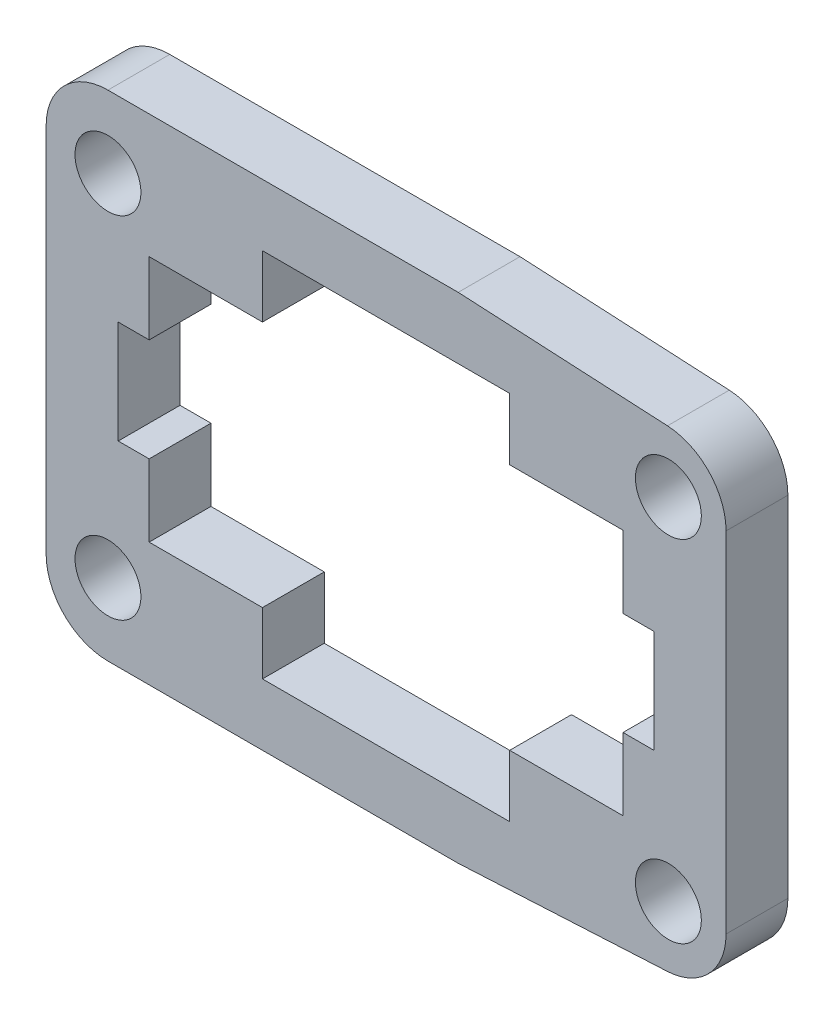
ISO-10303-21;
HEADER;
FILE_DESCRIPTION(('STEP AP214'),'2;1');
FILE_NAME('part.step','',(''),(''),'','','');
FILE_SCHEMA(('AUTOMOTIVE_DESIGN { 1 0 10303 214 1 1 1 1 }'));
ENDSEC;
DATA;
#1=APPLICATION_CONTEXT('core data for automotive mechanical design processes');
#2=APPLICATION_PROTOCOL_DEFINITION('international standard','automotive_design',2000,#1);
#3=PRODUCT_CONTEXT('',#1,'mechanical');
#4=PRODUCT('Part','Part','',(#3));
#5=PRODUCT_RELATED_PRODUCT_CATEGORY('part','',(#4));
#6=PRODUCT_DEFINITION_FORMATION('','',#4);
#7=PRODUCT_DEFINITION_CONTEXT('part definition',#1,'design');
#8=PRODUCT_DEFINITION('design','',#6,#7);
#9=PRODUCT_DEFINITION_SHAPE('','',#8);
#10=(LENGTH_UNIT() NAMED_UNIT(*) SI_UNIT(.MILLI.,.METRE.));
#11=(NAMED_UNIT(*) PLANE_ANGLE_UNIT() SI_UNIT($,.RADIAN.));
#12=(NAMED_UNIT(*) SI_UNIT($,.STERADIAN.) SOLID_ANGLE_UNIT());
#13=UNCERTAINTY_MEASURE_WITH_UNIT(LENGTH_MEASURE(1.E-05),#10,'distance_accuracy_value','');
#14=(GEOMETRIC_REPRESENTATION_CONTEXT(3) GLOBAL_UNCERTAINTY_ASSIGNED_CONTEXT((#13)) GLOBAL_UNIT_ASSIGNED_CONTEXT((#10,
#11,#12)) REPRESENTATION_CONTEXT('',''));
#15=CARTESIAN_POINT('',(0.,0.,0.));
#16=DIRECTION('',(0.,0.,1.));
#17=DIRECTION('',(1.,0.,0.));
#18=AXIS2_PLACEMENT_3D('',#15,#16,#17);
#19=CARTESIAN_POINT('',(24.0010920540107,23.4678047027526,0.));
#20=DIRECTION('',(0.0523034033778794,0.998631240245913,0.));
#21=DIRECTION('',(-0.998631240245913,0.0523034033778794,0.));
#22=AXIS2_PLACEMENT_3D('',#19,#20,#21);
#23=PLANE('',#22);
#24=DIRECTION('',(-0.998631240245913,0.0523034033778794,0.));
#25=VECTOR('',#24,1.);
#26=CARTESIAN_POINT('',(24.0010920540107,23.4678047027526,3.));
#27=LINE('',#26,#25);
#28=CARTESIAN_POINT('',(24.0010920540107,23.4678047027526,3.));
#29=VERTEX_POINT('',#28);
#30=CARTESIAN_POINT('',(13.8436818438771,23.9998,3.));
#31=VERTEX_POINT('',#30);
#32=EDGE_CURVE('E412',#29,#31,#27,.T.);
#33=ORIENTED_EDGE('',*,*,#32,.F.);
#34=DIRECTION('',(0.,0.,1.));
#35=VECTOR('',#34,1.);
#36=CARTESIAN_POINT('',(24.0010920540107,23.4678047027526,0.));
#37=LINE('',#36,#35);
#38=CARTESIAN_POINT('',(24.0010920540107,23.4678047027526,0.));
#39=VERTEX_POINT('',#38);
#40=EDGE_CURVE('E11',#39,#29,#37,.T.);
#41=ORIENTED_EDGE('',*,*,#40,.F.);
#42=DIRECTION('',(-0.998631240245913,0.0523034033778794,0.));
#43=VECTOR('',#42,1.);
#44=CARTESIAN_POINT('',(24.0010920540107,23.4678047027526,0.));
#45=LINE('',#44,#43);
#46=CARTESIAN_POINT('',(13.8436818438771,23.9998,0.));
#47=VERTEX_POINT('',#46);
#48=EDGE_CURVE('E466',#39,#47,#45,.T.);
#49=ORIENTED_EDGE('',*,*,#48,.T.);
#50=DIRECTION('',(0.,0.,1.));
#51=VECTOR('',#50,1.);
#52=CARTESIAN_POINT('',(13.8436818438771,23.9998,0.));
#53=LINE('',#52,#51);
#54=EDGE_CURVE('E42',#47,#31,#53,.T.);
#55=ORIENTED_EDGE('',*,*,#54,.T.);
#56=EDGE_LOOP('',(#33,#41,#49,#55));
#57=FACE_BOUND('',#56,.T.);
#58=ADVANCED_FACE('F39',(#57),#23,.T.);
#59=CARTESIAN_POINT('',(23.844181843877,20.4719109820149,0.));
#60=DIRECTION('',(0.,0.,1.));
#61=DIRECTION('',(1.,0.,0.));
#62=AXIS2_PLACEMENT_3D('',#59,#60,#61);
#63=CYLINDRICAL_SURFACE('',#62,2.99999999999996);
#64=CARTESIAN_POINT('',(23.844181843877,20.4719109820149,3.));
#65=DIRECTION('',(0.,0.,1.));
#66=DIRECTION('',(1.,0.,0.));
#67=AXIS2_PLACEMENT_3D('',#64,#65,#66);
#68=CIRCLE('',#67,2.99999999999996);
#69=CARTESIAN_POINT('',(26.844181843877,20.4719109820149,3.));
#70=VERTEX_POINT('',#69);
#71=EDGE_CURVE('E471',#70,#29,#68,.T.);
#72=ORIENTED_EDGE('',*,*,#71,.F.);
#73=DIRECTION('',(0.,0.,1.));
#74=VECTOR('',#73,1.);
#75=CARTESIAN_POINT('',(26.844181843877,20.4719109820149,0.));
#76=LINE('',#75,#74);
#77=CARTESIAN_POINT('',(26.844181843877,20.4719109820149,0.));
#78=VERTEX_POINT('',#77);
#79=EDGE_CURVE('E48',#78,#70,#76,.T.);
#80=ORIENTED_EDGE('',*,*,#79,.F.);
#81=CARTESIAN_POINT('',(23.844181843877,20.4719109820149,0.));
#82=DIRECTION('',(0.,0.,1.));
#83=DIRECTION('',(1.,0.,0.));
#84=AXIS2_PLACEMENT_3D('',#81,#82,#83);
#85=CIRCLE('',#84,2.99999999999996);
#86=EDGE_CURVE('E503',#78,#39,#85,.T.);
#87=ORIENTED_EDGE('',*,*,#86,.T.);
#88=ORIENTED_EDGE('',*,*,#40,.T.);
#89=EDGE_LOOP('',(#72,#80,#87,#88));
#90=FACE_BOUND('',#89,.T.);
#91=ADVANCED_FACE('F580',(#90),#63,.T.);
#92=CARTESIAN_POINT('',(26.844181843877,3.52888902362418,0.));
#93=DIRECTION('',(1.,0.,0.));
#94=DIRECTION('',(0.,1.,0.));
#95=AXIS2_PLACEMENT_3D('',#92,#93,#94);
#96=PLANE('',#95);
#97=DIRECTION('',(0.,1.,0.));
#98=VECTOR('',#97,1.);
#99=CARTESIAN_POINT('',(26.844181843877,3.52888902362418,3.));
#100=LINE('',#99,#98);
#101=CARTESIAN_POINT('',(26.844181843877,3.52888902362418,3.));
#102=VERTEX_POINT('',#101);
#103=EDGE_CURVE('E538',#102,#70,#100,.T.);
#104=ORIENTED_EDGE('',*,*,#103,.F.);
#105=DIRECTION('',(0.,0.,1.));
#106=VECTOR('',#105,1.);
#107=CARTESIAN_POINT('',(26.844181843877,3.52888902362418,0.));
#108=LINE('',#107,#106);
#109=CARTESIAN_POINT('',(26.844181843877,3.52888902362418,0.));
#110=VERTEX_POINT('',#109);
#111=EDGE_CURVE('E547',#110,#102,#108,.T.);
#112=ORIENTED_EDGE('',*,*,#111,.F.);
#113=DIRECTION('',(0.,1.,0.));
#114=VECTOR('',#113,1.);
#115=CARTESIAN_POINT('',(26.844181843877,3.52888902362418,0.));
#116=LINE('',#115,#114);
#117=EDGE_CURVE('E499',#110,#78,#116,.T.);
#118=ORIENTED_EDGE('',*,*,#117,.T.);
#119=ORIENTED_EDGE('',*,*,#79,.T.);
#120=EDGE_LOOP('',(#104,#112,#118,#119));
#121=FACE_BOUND('',#120,.T.);
#122=ADVANCED_FACE('F607',(#121),#96,.T.);
#123=CARTESIAN_POINT('',(23.844181843877,3.52888902362418,0.));
#124=DIRECTION('',(0.,0.,1.));
#125=DIRECTION('',(1.,0.,0.));
#126=AXIS2_PLACEMENT_3D('',#123,#124,#125);
#127=CYLINDRICAL_SURFACE('',#126,3.);
#128=CARTESIAN_POINT('',(23.844181843877,3.52888902362418,3.));
#129=DIRECTION('',(0.,0.,1.));
#130=DIRECTION('',(1.,0.,0.));
#131=AXIS2_PLACEMENT_3D('',#128,#129,#130);
#132=CIRCLE('',#131,3.);
#133=CARTESIAN_POINT('',(24.0013861888821,0.533010722706151,3.));
#134=VERTEX_POINT('',#133);
#135=EDGE_CURVE('E534',#134,#102,#132,.T.);
#136=ORIENTED_EDGE('',*,*,#135,.F.);
#137=DIRECTION('',(0.,0.,1.));
#138=VECTOR('',#137,1.);
#139=CARTESIAN_POINT('',(24.0013861888821,0.533010722706151,0.));
#140=LINE('',#139,#138);
#141=CARTESIAN_POINT('',(24.0013861888821,0.533010722706151,0.));
#142=VERTEX_POINT('',#141);
#143=EDGE_CURVE('E550',#142,#134,#140,.T.);
#144=ORIENTED_EDGE('',*,*,#143,.F.);
#145=CARTESIAN_POINT('',(23.844181843877,3.52888902362418,0.));
#146=DIRECTION('',(0.,0.,1.));
#147=DIRECTION('',(1.,0.,0.));
#148=AXIS2_PLACEMENT_3D('',#145,#146,#147);
#149=CIRCLE('',#148,3.);
#150=EDGE_CURVE('E495',#142,#110,#149,.T.);
#151=ORIENTED_EDGE('',*,*,#150,.T.);
#152=ORIENTED_EDGE('',*,*,#111,.T.);
#153=EDGE_LOOP('',(#136,#144,#151,#152));
#154=FACE_BOUND('',#153,.T.);
#155=ADVANCED_FACE('F605',(#154),#127,.T.);
#156=CARTESIAN_POINT('',(13.8436818438771,0.,0.));
#157=DIRECTION('',(0.0524014483350339,-0.998626100306011,0.));
#158=DIRECTION('',(0.998626100306011,0.0524014483350339,0.));
#159=AXIS2_PLACEMENT_3D('',#156,#157,#158);
#160=PLANE('',#159);
#161=DIRECTION('',(0.998626100306011,0.0524014483350339,0.));
#162=VECTOR('',#161,1.);
#163=CARTESIAN_POINT('',(13.8436818438771,0.,3.));
#164=LINE('',#163,#162);
#165=CARTESIAN_POINT('',(13.8436818438771,0.,3.));
#166=VERTEX_POINT('',#165);
#167=EDGE_CURVE('E530',#166,#134,#164,.T.);
#168=ORIENTED_EDGE('',*,*,#167,.F.);
#169=DIRECTION('',(0.,0.,1.));
#170=VECTOR('',#169,1.);
#171=CARTESIAN_POINT('',(13.8436818438771,0.,0.));
#172=LINE('',#171,#170);
#173=CARTESIAN_POINT('',(13.8436818438771,0.,0.));
#174=VERTEX_POINT('',#173);
#175=EDGE_CURVE('E553',#174,#166,#172,.T.);
#176=ORIENTED_EDGE('',*,*,#175,.F.);
#177=DIRECTION('',(0.998626100306011,0.0524014483350339,0.));
#178=VECTOR('',#177,1.);
#179=CARTESIAN_POINT('',(13.8436818438771,0.,0.));
#180=LINE('',#179,#178);
#181=EDGE_CURVE('E491',#174,#142,#180,.T.);
#182=ORIENTED_EDGE('',*,*,#181,.T.);
#183=ORIENTED_EDGE('',*,*,#143,.T.);
#184=EDGE_LOOP('',(#168,#176,#182,#183));
#185=FACE_BOUND('',#184,.T.);
#186=ADVANCED_FACE('F601',(#185),#160,.T.);
#187=CARTESIAN_POINT('',(-3.15711815612296,0.,0.));
#188=DIRECTION('',(0.,-1.,0.));
#189=DIRECTION('',(0.,0.,-1.));
#190=AXIS2_PLACEMENT_3D('',#187,#188,#189);
#191=PLANE('',#190);
#192=DIRECTION('',(1.,0.,0.));
#193=VECTOR('',#192,1.);
#194=CARTESIAN_POINT('',(-3.15711815612296,0.,3.));
#195=LINE('',#194,#193);
#196=CARTESIAN_POINT('',(-3.15711815612296,0.,3.));
#197=VERTEX_POINT('',#196);
#198=EDGE_CURVE('E526',#197,#166,#195,.T.);
#199=ORIENTED_EDGE('',*,*,#198,.F.);
#200=DIRECTION('',(0.,0.,1.));
#201=VECTOR('',#200,1.);
#202=CARTESIAN_POINT('',(-3.15711815612296,0.,0.));
#203=LINE('',#202,#201);
#204=CARTESIAN_POINT('',(-3.15711815612296,0.,0.));
#205=VERTEX_POINT('',#204);
#206=EDGE_CURVE('E556',#205,#197,#203,.T.);
#207=ORIENTED_EDGE('',*,*,#206,.F.);
#208=DIRECTION('',(1.,0.,0.));
#209=VECTOR('',#208,1.);
#210=CARTESIAN_POINT('',(-3.15711815612296,0.,0.));
#211=LINE('',#210,#209);
#212=EDGE_CURVE('E487',#205,#174,#211,.T.);
#213=ORIENTED_EDGE('',*,*,#212,.T.);
#214=ORIENTED_EDGE('',*,*,#175,.T.);
#215=EDGE_LOOP('',(#199,#207,#213,#214));
#216=FACE_BOUND('',#215,.T.);
#217=ADVANCED_FACE('F597',(#216),#191,.T.);
#218=CARTESIAN_POINT('',(-3.15711815612296,3.,0.));
#219=DIRECTION('',(0.,0.,1.));
#220=DIRECTION('',(1.,0.,0.));
#221=AXIS2_PLACEMENT_3D('',#218,#219,#220);
#222=CYLINDRICAL_SURFACE('',#221,3.);
#223=CARTESIAN_POINT('',(-3.15711815612296,3.,3.));
#224=DIRECTION('',(0.,0.,1.));
#225=DIRECTION('',(1.,0.,0.));
#226=AXIS2_PLACEMENT_3D('',#223,#224,#225);
#227=CIRCLE('',#226,3.);
#228=CARTESIAN_POINT('',(-6.15711815612296,3.,3.));
#229=VERTEX_POINT('',#228);
#230=EDGE_CURVE('E522',#229,#197,#227,.T.);
#231=ORIENTED_EDGE('',*,*,#230,.F.);
#232=DIRECTION('',(0.,0.,1.));
#233=VECTOR('',#232,1.);
#234=CARTESIAN_POINT('',(-6.15711815612296,3.,0.));
#235=LINE('',#234,#233);
#236=CARTESIAN_POINT('',(-6.15711815612296,3.,0.));
#237=VERTEX_POINT('',#236);
#238=EDGE_CURVE('E559',#237,#229,#235,.T.);
#239=ORIENTED_EDGE('',*,*,#238,.F.);
#240=CARTESIAN_POINT('',(-3.15711815612296,3.,0.));
#241=DIRECTION('',(0.,0.,1.));
#242=DIRECTION('',(1.,0.,0.));
#243=AXIS2_PLACEMENT_3D('',#240,#241,#242);
#244=CIRCLE('',#243,3.);
#245=EDGE_CURVE('E483',#237,#205,#244,.T.);
#246=ORIENTED_EDGE('',*,*,#245,.T.);
#247=ORIENTED_EDGE('',*,*,#206,.T.);
#248=EDGE_LOOP('',(#231,#239,#246,#247));
#249=FACE_BOUND('',#248,.T.);
#250=ADVANCED_FACE('F593',(#249),#222,.T.);
#251=CARTESIAN_POINT('',(-6.15711815612297,20.9998,0.));
#252=DIRECTION('',(-1.,0.,0.));
#253=DIRECTION('',(0.,-1.,0.));
#254=AXIS2_PLACEMENT_3D('',#251,#252,#253);
#255=PLANE('',#254);
#256=DIRECTION('',(0.,-1.,0.));
#257=VECTOR('',#256,1.);
#258=CARTESIAN_POINT('',(-6.15711815612297,20.9998,3.));
#259=LINE('',#258,#257);
#260=CARTESIAN_POINT('',(-6.15711815612296,20.9998,3.));
#261=VERTEX_POINT('',#260);
#262=EDGE_CURVE('E518',#261,#229,#259,.T.);
#263=ORIENTED_EDGE('',*,*,#262,.F.);
#264=DIRECTION('',(0.,0.,1.));
#265=VECTOR('',#264,1.);
#266=CARTESIAN_POINT('',(-6.15711815612296,20.9998,0.));
#267=LINE('',#266,#265);
#268=CARTESIAN_POINT('',(-6.15711815612296,20.9998,0.));
#269=VERTEX_POINT('',#268);
#270=EDGE_CURVE('E562',#269,#261,#267,.T.);
#271=ORIENTED_EDGE('',*,*,#270,.F.);
#272=DIRECTION('',(0.,-1.,0.));
#273=VECTOR('',#272,1.);
#274=CARTESIAN_POINT('',(-6.15711815612297,20.9998,0.));
#275=LINE('',#274,#273);
#276=EDGE_CURVE('E479',#269,#237,#275,.T.);
#277=ORIENTED_EDGE('',*,*,#276,.T.);
#278=ORIENTED_EDGE('',*,*,#238,.T.);
#279=EDGE_LOOP('',(#263,#271,#277,#278));
#280=FACE_BOUND('',#279,.T.);
#281=ADVANCED_FACE('F591',(#280),#255,.T.);
#282=CARTESIAN_POINT('',(-3.15711815612296,20.9998,0.));
#283=DIRECTION('',(0.,0.,1.));
#284=DIRECTION('',(1.,0.,0.));
#285=AXIS2_PLACEMENT_3D('',#282,#283,#284);
#286=CYLINDRICAL_SURFACE('',#285,3.);
#287=CARTESIAN_POINT('',(-3.15711815612296,20.9998,3.));
#288=DIRECTION('',(0.,0.,1.));
#289=DIRECTION('',(1.,0.,0.));
#290=AXIS2_PLACEMENT_3D('',#287,#288,#289);
#291=CIRCLE('',#290,3.);
#292=CARTESIAN_POINT('',(-3.15711815612296,23.9998,3.));
#293=VERTEX_POINT('',#292);
#294=EDGE_CURVE('E514',#293,#261,#291,.T.);
#295=ORIENTED_EDGE('',*,*,#294,.F.);
#296=DIRECTION('',(0.,0.,1.));
#297=VECTOR('',#296,1.);
#298=CARTESIAN_POINT('',(-3.15711815612296,23.9998,0.));
#299=LINE('',#298,#297);
#300=CARTESIAN_POINT('',(-3.15711815612296,23.9998,0.));
#301=VERTEX_POINT('',#300);
#302=EDGE_CURVE('E564',#301,#293,#299,.T.);
#303=ORIENTED_EDGE('',*,*,#302,.F.);
#304=CARTESIAN_POINT('',(-3.15711815612296,20.9998,0.));
#305=DIRECTION('',(0.,0.,1.));
#306=DIRECTION('',(1.,0.,0.));
#307=AXIS2_PLACEMENT_3D('',#304,#305,#306);
#308=CIRCLE('',#307,3.);
#309=EDGE_CURVE('E475',#301,#269,#308,.T.);
#310=ORIENTED_EDGE('',*,*,#309,.T.);
#311=ORIENTED_EDGE('',*,*,#270,.T.);
#312=EDGE_LOOP('',(#295,#303,#310,#311));
#313=FACE_BOUND('',#312,.T.);
#314=ADVANCED_FACE('F587',(#313),#286,.T.);
#315=CARTESIAN_POINT('',(13.8436818438771,23.9998,0.));
#316=DIRECTION('',(0.,1.,0.));
#317=DIRECTION('',(0.,0.,1.));
#318=AXIS2_PLACEMENT_3D('',#315,#316,#317);
#319=PLANE('',#318);
#320=DIRECTION('',(-1.,0.,0.));
#321=VECTOR('',#320,1.);
#322=CARTESIAN_POINT('',(13.8436818438771,23.9998,3.));
#323=LINE('',#322,#321);
#324=EDGE_CURVE('E510',#31,#293,#323,.T.);
#325=ORIENTED_EDGE('',*,*,#324,.F.);
#326=ORIENTED_EDGE('',*,*,#54,.F.);
#327=DIRECTION('',(-1.,0.,0.));
#328=VECTOR('',#327,1.);
#329=CARTESIAN_POINT('',(13.8436818438771,23.9998,0.));
#330=LINE('',#329,#328);
#331=EDGE_CURVE('E470',#47,#301,#330,.T.);
#332=ORIENTED_EDGE('',*,*,#331,.T.);
#333=ORIENTED_EDGE('',*,*,#302,.T.);
#334=EDGE_LOOP('',(#325,#326,#332,#333));
#335=FACE_BOUND('',#334,.T.);
#336=ADVANCED_FACE('F574',(#335),#319,.T.);
#337=CARTESIAN_POINT('',(-3.15711815612296,20.9998,0.));
#338=DIRECTION('',(0.,0.,1.));
#339=DIRECTION('',(1.,0.,0.));
#340=AXIS2_PLACEMENT_3D('',#337,#338,#339);
#341=PLANE('',#340);
#342=CARTESIAN_POINT('',(-3.15601815612294,3.50114834928544,0.));
#343=DIRECTION('',(0.,0.,1.));
#344=DIRECTION('',(1.,0.,0.));
#345=AXIS2_PLACEMENT_3D('',#342,#343,#344);
#346=CIRCLE('',#345,1.6);
#347=CARTESIAN_POINT('',(-1.55601815612294,3.50114834928544,0.));
#348=VERTEX_POINT('',#347);
#349=EDGE_CURVE('E940',#348,#348,#346,.T.);
#350=ORIENTED_EDGE('',*,*,#349,.T.);
#351=EDGE_LOOP('',(#350));
#352=FACE_BOUND('',#351,.T.);
#353=CARTESIAN_POINT('',(24.044031843877,3.50114834928544,0.));
#354=DIRECTION('',(0.,0.,1.));
#355=DIRECTION('',(1.,0.,0.));
#356=AXIS2_PLACEMENT_3D('',#353,#354,#355);
#357=CIRCLE('',#356,1.6);
#358=CARTESIAN_POINT('',(25.644031843877,3.50114834928544,0.));
#359=VERTEX_POINT('',#358);
#360=EDGE_CURVE('E967',#359,#359,#357,.T.);
#361=ORIENTED_EDGE('',*,*,#360,.T.);
#362=EDGE_LOOP('',(#361));
#363=FACE_BOUND('',#362,.T.);
#364=CARTESIAN_POINT('',(24.044031843877,20.4983516507146,0.));
#365=DIRECTION('',(0.,0.,1.));
#366=DIRECTION('',(1.,0.,0.));
#367=AXIS2_PLACEMENT_3D('',#364,#365,#366);
#368=CIRCLE('',#367,1.6);
#369=CARTESIAN_POINT('',(25.644031843877,20.4983516507146,0.));
#370=VERTEX_POINT('',#369);
#371=EDGE_CURVE('E956',#370,#370,#368,.T.);
#372=ORIENTED_EDGE('',*,*,#371,.T.);
#373=EDGE_LOOP('',(#372));
#374=FACE_BOUND('',#373,.T.);
#375=CARTESIAN_POINT('',(-3.15601815612294,20.4983516507146,0.));
#376=DIRECTION('',(0.,0.,1.));
#377=DIRECTION('',(1.,0.,0.));
#378=AXIS2_PLACEMENT_3D('',#375,#376,#377);
#379=CIRCLE('',#378,1.6);
#380=CARTESIAN_POINT('',(-1.55601815612294,20.4983516507146,0.));
#381=VERTEX_POINT('',#380);
#382=EDGE_CURVE('E339',#381,#381,#379,.T.);
#383=ORIENTED_EDGE('',*,*,#382,.T.);
#384=EDGE_LOOP('',(#383));
#385=FACE_BOUND('',#384,.T.);
#386=DIRECTION('',(-1.,0.,0.));
#387=VECTOR('',#386,1.);
#388=CARTESIAN_POINT('',(21.843181843877,14.4995,0.));
#389=LINE('',#388,#387);
#390=CARTESIAN_POINT('',(23.343481843877,14.4995,0.));
#391=VERTEX_POINT('',#390);
#392=CARTESIAN_POINT('',(21.843181843877,14.4995,0.));
#393=VERTEX_POINT('',#392);
#394=EDGE_CURVE('E246',#391,#393,#389,.T.);
#395=ORIENTED_EDGE('',*,*,#394,.T.);
#396=DIRECTION('',(0.,1.,0.));
#397=VECTOR('',#396,1.);
#398=CARTESIAN_POINT('',(21.843181843877,17.9998,0.));
#399=LINE('',#398,#397);
#400=CARTESIAN_POINT('',(21.843181843877,17.9998,0.));
#401=VERTEX_POINT('',#400);
#402=EDGE_CURVE('E239',#393,#401,#399,.T.);
#403=ORIENTED_EDGE('',*,*,#402,.T.);
#404=DIRECTION('',(-1.,0.,0.));
#405=VECTOR('',#404,1.);
#406=CARTESIAN_POINT('',(16.3433818438771,17.9998,0.));
#407=LINE('',#406,#405);
#408=CARTESIAN_POINT('',(16.3433818438771,17.9998,0.));
#409=VERTEX_POINT('',#408);
#410=EDGE_CURVE('E249',#401,#409,#407,.T.);
#411=ORIENTED_EDGE('',*,*,#410,.T.);
#412=DIRECTION('',(0.,1.,0.));
#413=VECTOR('',#412,1.);
#414=CARTESIAN_POINT('',(16.3433818438771,20.9998,0.));
#415=LINE('',#414,#413);
#416=CARTESIAN_POINT('',(16.3433818438771,20.9998,0.));
#417=VERTEX_POINT('',#416);
#418=EDGE_CURVE('E56',#409,#417,#415,.T.);
#419=ORIENTED_EDGE('',*,*,#418,.T.);
#420=DIRECTION('',(-1.,0.,0.));
#421=VECTOR('',#420,1.);
#422=CARTESIAN_POINT('',(4.34338184387702,20.9998,0.));
#423=LINE('',#422,#421);
#424=CARTESIAN_POINT('',(4.34338184387702,20.9998,0.));
#425=VERTEX_POINT('',#424);
#426=EDGE_CURVE('E271',#417,#425,#423,.T.);
#427=ORIENTED_EDGE('',*,*,#426,.T.);
#428=DIRECTION('',(0.,-1.,0.));
#429=VECTOR('',#428,1.);
#430=CARTESIAN_POINT('',(4.34338184387702,17.9998,0.));
#431=LINE('',#430,#429);
#432=CARTESIAN_POINT('',(4.34338184387702,17.9998,0.));
#433=VERTEX_POINT('',#432);
#434=EDGE_CURVE('E275',#425,#433,#431,.T.);
#435=ORIENTED_EDGE('',*,*,#434,.T.);
#436=DIRECTION('',(-1.,0.,0.));
#437=VECTOR('',#436,1.);
#438=CARTESIAN_POINT('',(-1.15651815612298,17.9998,0.));
#439=LINE('',#438,#437);
#440=CARTESIAN_POINT('',(-1.15651815612298,17.9998,0.));
#441=VERTEX_POINT('',#440);
#442=EDGE_CURVE('E279',#433,#441,#439,.T.);
#443=ORIENTED_EDGE('',*,*,#442,.T.);
#444=DIRECTION('',(0.,-1.,0.));
#445=VECTOR('',#444,1.);
#446=CARTESIAN_POINT('',(-1.15651815612297,14.4995,0.));
#447=LINE('',#446,#445);
#448=CARTESIAN_POINT('',(-1.15651815612297,14.4995,0.));
#449=VERTEX_POINT('',#448);
#450=EDGE_CURVE('E283',#441,#449,#447,.T.);
#451=ORIENTED_EDGE('',*,*,#450,.T.);
#452=DIRECTION('',(-1.,0.,0.));
#453=VECTOR('',#452,1.);
#454=CARTESIAN_POINT('',(-2.65681815612294,14.4995,0.));
#455=LINE('',#454,#453);
#456=CARTESIAN_POINT('',(-2.65681815612294,14.4995,0.));
#457=VERTEX_POINT('',#456);
#458=EDGE_CURVE('E287',#449,#457,#455,.T.);
#459=ORIENTED_EDGE('',*,*,#458,.T.);
#460=DIRECTION('',(0.,-1.,0.));
#461=VECTOR('',#460,1.);
#462=CARTESIAN_POINT('',(-2.65681815612294,9.5,0.));
#463=LINE('',#462,#461);
#464=CARTESIAN_POINT('',(-2.65681815612294,9.5,0.));
#465=VERTEX_POINT('',#464);
#466=EDGE_CURVE('E291',#457,#465,#463,.T.);
#467=ORIENTED_EDGE('',*,*,#466,.T.);
#468=DIRECTION('',(1.,0.,0.));
#469=VECTOR('',#468,1.);
#470=CARTESIAN_POINT('',(-1.15651815612297,9.5,0.));
#471=LINE('',#470,#469);
#472=CARTESIAN_POINT('',(-1.15651815612297,9.5,0.));
#473=VERTEX_POINT('',#472);
#474=EDGE_CURVE('E295',#465,#473,#471,.T.);
#475=ORIENTED_EDGE('',*,*,#474,.T.);
#476=DIRECTION('',(0.,-1.,0.));
#477=VECTOR('',#476,1.);
#478=CARTESIAN_POINT('',(-1.15651815612298,6.,0.));
#479=LINE('',#478,#477);
#480=CARTESIAN_POINT('',(-1.15651815612298,6.,0.));
#481=VERTEX_POINT('',#480);
#482=EDGE_CURVE('E299',#473,#481,#479,.T.);
#483=ORIENTED_EDGE('',*,*,#482,.T.);
#484=DIRECTION('',(1.,0.,0.));
#485=VECTOR('',#484,1.);
#486=CARTESIAN_POINT('',(4.34338184387701,6.,0.));
#487=LINE('',#486,#485);
#488=CARTESIAN_POINT('',(4.34338184387701,6.,0.));
#489=VERTEX_POINT('',#488);
#490=EDGE_CURVE('E303',#481,#489,#487,.T.);
#491=ORIENTED_EDGE('',*,*,#490,.T.);
#492=DIRECTION('',(0.,-1.,0.));
#493=VECTOR('',#492,1.);
#494=CARTESIAN_POINT('',(4.34338184387701,3.,0.));
#495=LINE('',#494,#493);
#496=CARTESIAN_POINT('',(4.34338184387701,3.,0.));
#497=VERTEX_POINT('',#496);
#498=EDGE_CURVE('E307',#489,#497,#495,.T.);
#499=ORIENTED_EDGE('',*,*,#498,.T.);
#500=DIRECTION('',(1.,0.,0.));
#501=VECTOR('',#500,1.);
#502=CARTESIAN_POINT('',(16.3433818438771,3.,0.));
#503=LINE('',#502,#501);
#504=CARTESIAN_POINT('',(16.3433818438771,3.,0.));
#505=VERTEX_POINT('',#504);
#506=EDGE_CURVE('E311',#497,#505,#503,.T.);
#507=ORIENTED_EDGE('',*,*,#506,.T.);
#508=DIRECTION('',(0.,1.,0.));
#509=VECTOR('',#508,1.);
#510=CARTESIAN_POINT('',(16.3433818438771,6.,0.));
#511=LINE('',#510,#509);
#512=CARTESIAN_POINT('',(16.3433818438771,6.,0.));
#513=VERTEX_POINT('',#512);
#514=EDGE_CURVE('E315',#505,#513,#511,.T.);
#515=ORIENTED_EDGE('',*,*,#514,.T.);
#516=DIRECTION('',(1.,0.,0.));
#517=VECTOR('',#516,1.);
#518=CARTESIAN_POINT('',(21.843181843877,6.,0.));
#519=LINE('',#518,#517);
#520=CARTESIAN_POINT('',(21.843181843877,6.,0.));
#521=VERTEX_POINT('',#520);
#522=EDGE_CURVE('E319',#513,#521,#519,.T.);
#523=ORIENTED_EDGE('',*,*,#522,.T.);
#524=DIRECTION('',(0.,1.,0.));
#525=VECTOR('',#524,1.);
#526=CARTESIAN_POINT('',(21.843181843877,9.5,0.));
#527=LINE('',#526,#525);
#528=CARTESIAN_POINT('',(21.843181843877,9.5,0.));
#529=VERTEX_POINT('',#528);
#530=EDGE_CURVE('E323',#521,#529,#527,.T.);
#531=ORIENTED_EDGE('',*,*,#530,.T.);
#532=DIRECTION('',(1.,0.,0.));
#533=VECTOR('',#532,1.);
#534=CARTESIAN_POINT('',(23.343481843877,9.5,0.));
#535=LINE('',#534,#533);
#536=CARTESIAN_POINT('',(23.343481843877,9.5,0.));
#537=VERTEX_POINT('',#536);
#538=EDGE_CURVE('E327',#529,#537,#535,.T.);
#539=ORIENTED_EDGE('',*,*,#538,.T.);
#540=DIRECTION('',(0.,1.,0.));
#541=VECTOR('',#540,1.);
#542=CARTESIAN_POINT('',(23.343481843877,14.4995,0.));
#543=LINE('',#542,#541);
#544=EDGE_CURVE('E331',#537,#391,#543,.T.);
#545=ORIENTED_EDGE('',*,*,#544,.T.);
#546=EDGE_LOOP('',(#395,#403,#411,#419,#427,#435,#443,#451,#459,#467,#475,#483,#491,#499,#507,
#515,#523,#531,#539,#545));
#547=FACE_BOUND('',#546,.T.);
#548=ORIENTED_EDGE('',*,*,#48,.F.);
#549=ORIENTED_EDGE('',*,*,#86,.F.);
#550=ORIENTED_EDGE('',*,*,#117,.F.);
#551=ORIENTED_EDGE('',*,*,#150,.F.);
#552=ORIENTED_EDGE('',*,*,#181,.F.);
#553=ORIENTED_EDGE('',*,*,#212,.F.);
#554=ORIENTED_EDGE('',*,*,#245,.F.);
#555=ORIENTED_EDGE('',*,*,#276,.F.);
#556=ORIENTED_EDGE('',*,*,#309,.F.);
#557=ORIENTED_EDGE('',*,*,#331,.F.);
#558=EDGE_LOOP('',(#548,#549,#550,#551,#552,#553,#554,#555,#556,#557));
#559=FACE_BOUND('',#558,.T.);
#560=ADVANCED_FACE('F254',(#352,#363,#374,#385,#547,#559),#341,.F.);
#561=CARTESIAN_POINT('',(-3.15711815612296,20.9998,3.));
#562=DIRECTION('',(0.,0.,1.));
#563=DIRECTION('',(1.,0.,0.));
#564=AXIS2_PLACEMENT_3D('',#561,#562,#563);
#565=PLANE('',#564);
#566=CARTESIAN_POINT('',(-3.15601815612294,3.50114834928544,3.));
#567=DIRECTION('',(0.,0.,1.));
#568=DIRECTION('',(1.,0.,0.));
#569=AXIS2_PLACEMENT_3D('',#566,#567,#568);
#570=CIRCLE('',#569,1.6);
#571=CARTESIAN_POINT('',(-1.55601815612294,3.50114834928544,3.));
#572=VERTEX_POINT('',#571);
#573=EDGE_CURVE('E943',#572,#572,#570,.T.);
#574=ORIENTED_EDGE('',*,*,#573,.F.);
#575=EDGE_LOOP('',(#574));
#576=FACE_BOUND('',#575,.T.);
#577=CARTESIAN_POINT('',(24.044031843877,3.50114834928544,3.));
#578=DIRECTION('',(0.,0.,1.));
#579=DIRECTION('',(1.,0.,0.));
#580=AXIS2_PLACEMENT_3D('',#577,#578,#579);
#581=CIRCLE('',#580,1.6);
#582=CARTESIAN_POINT('',(25.644031843877,3.50114834928544,3.));
#583=VERTEX_POINT('',#582);
#584=EDGE_CURVE('E947',#583,#583,#581,.T.);
#585=ORIENTED_EDGE('',*,*,#584,.F.);
#586=EDGE_LOOP('',(#585));
#587=FACE_BOUND('',#586,.T.);
#588=CARTESIAN_POINT('',(24.044031843877,20.4983516507146,3.));
#589=DIRECTION('',(0.,0.,1.));
#590=DIRECTION('',(1.,0.,0.));
#591=AXIS2_PLACEMENT_3D('',#588,#589,#590);
#592=CIRCLE('',#591,1.6);
#593=CARTESIAN_POINT('',(25.644031843877,20.4983516507146,3.));
#594=VERTEX_POINT('',#593);
#595=EDGE_CURVE('E961',#594,#594,#592,.T.);
#596=ORIENTED_EDGE('',*,*,#595,.F.);
#597=EDGE_LOOP('',(#596));
#598=FACE_BOUND('',#597,.T.);
#599=CARTESIAN_POINT('',(-3.15601815612294,20.4983516507146,3.));
#600=DIRECTION('',(0.,0.,1.));
#601=DIRECTION('',(1.,0.,0.));
#602=AXIS2_PLACEMENT_3D('',#599,#600,#601);
#603=CIRCLE('',#602,1.6);
#604=CARTESIAN_POINT('',(-1.55601815612294,20.4983516507146,3.));
#605=VERTEX_POINT('',#604);
#606=EDGE_CURVE('E266',#605,#605,#603,.T.);
#607=ORIENTED_EDGE('',*,*,#606,.F.);
#608=EDGE_LOOP('',(#607));
#609=FACE_BOUND('',#608,.T.);
#610=DIRECTION('',(0.,1.,0.));
#611=VECTOR('',#610,1.);
#612=CARTESIAN_POINT('',(21.843181843877,17.9998,3.));
#613=LINE('',#612,#611);
#614=CARTESIAN_POINT('',(21.843181843877,14.4995,3.));
#615=VERTEX_POINT('',#614);
#616=CARTESIAN_POINT('',(21.843181843877,17.9998,3.));
#617=VERTEX_POINT('',#616);
#618=EDGE_CURVE('E64',#615,#617,#613,.T.);
#619=ORIENTED_EDGE('',*,*,#618,.F.);
#620=DIRECTION('',(-1.,0.,0.));
#621=VECTOR('',#620,1.);
#622=CARTESIAN_POINT('',(21.843181843877,14.4995,3.));
#623=LINE('',#622,#621);
#624=CARTESIAN_POINT('',(23.343481843877,14.4995,3.));
#625=VERTEX_POINT('',#624);
#626=EDGE_CURVE('E259',#625,#615,#623,.T.);
#627=ORIENTED_EDGE('',*,*,#626,.F.);
#628=DIRECTION('',(0.,1.,0.));
#629=VECTOR('',#628,1.);
#630=CARTESIAN_POINT('',(23.343481843877,14.4995,3.));
#631=LINE('',#630,#629);
#632=CARTESIAN_POINT('',(23.343481843877,9.5,3.));
#633=VERTEX_POINT('',#632);
#634=EDGE_CURVE('E263',#633,#625,#631,.T.);
#635=ORIENTED_EDGE('',*,*,#634,.F.);
#636=DIRECTION('',(1.,0.,0.));
#637=VECTOR('',#636,1.);
#638=CARTESIAN_POINT('',(23.343481843877,9.5,3.));
#639=LINE('',#638,#637);
#640=CARTESIAN_POINT('',(21.843181843877,9.5,3.));
#641=VERTEX_POINT('',#640);
#642=EDGE_CURVE('E402',#641,#633,#639,.T.);
#643=ORIENTED_EDGE('',*,*,#642,.F.);
#644=DIRECTION('',(0.,1.,0.));
#645=VECTOR('',#644,1.);
#646=CARTESIAN_POINT('',(21.843181843877,9.5,3.));
#647=LINE('',#646,#645);
#648=CARTESIAN_POINT('',(21.843181843877,6.,3.));
#649=VERTEX_POINT('',#648);
#650=EDGE_CURVE('E398',#649,#641,#647,.T.);
#651=ORIENTED_EDGE('',*,*,#650,.F.);
#652=DIRECTION('',(1.,0.,0.));
#653=VECTOR('',#652,1.);
#654=CARTESIAN_POINT('',(21.843181843877,6.,3.));
#655=LINE('',#654,#653);
#656=CARTESIAN_POINT('',(16.3433818438771,6.,3.));
#657=VERTEX_POINT('',#656);
#658=EDGE_CURVE('E394',#657,#649,#655,.T.);
#659=ORIENTED_EDGE('',*,*,#658,.F.);
#660=DIRECTION('',(0.,1.,0.));
#661=VECTOR('',#660,1.);
#662=CARTESIAN_POINT('',(16.3433818438771,6.,3.));
#663=LINE('',#662,#661);
#664=CARTESIAN_POINT('',(16.3433818438771,3.,3.));
#665=VERTEX_POINT('',#664);
#666=EDGE_CURVE('E390',#665,#657,#663,.T.);
#667=ORIENTED_EDGE('',*,*,#666,.F.);
#668=DIRECTION('',(1.,0.,0.));
#669=VECTOR('',#668,1.);
#670=CARTESIAN_POINT('',(16.3433818438771,3.,3.));
#671=LINE('',#670,#669);
#672=CARTESIAN_POINT('',(4.34338184387701,3.,3.));
#673=VERTEX_POINT('',#672);
#674=EDGE_CURVE('E386',#673,#665,#671,.T.);
#675=ORIENTED_EDGE('',*,*,#674,.F.);
#676=DIRECTION('',(0.,-1.,0.));
#677=VECTOR('',#676,1.);
#678=CARTESIAN_POINT('',(4.34338184387701,3.,3.));
#679=LINE('',#678,#677);
#680=CARTESIAN_POINT('',(4.34338184387701,6.,3.));
#681=VERTEX_POINT('',#680);
#682=EDGE_CURVE('E382',#681,#673,#679,.T.);
#683=ORIENTED_EDGE('',*,*,#682,.F.);
#684=DIRECTION('',(1.,0.,0.));
#685=VECTOR('',#684,1.);
#686=CARTESIAN_POINT('',(4.34338184387701,6.,3.));
#687=LINE('',#686,#685);
#688=CARTESIAN_POINT('',(-1.15651815612298,6.,3.));
#689=VERTEX_POINT('',#688);
#690=EDGE_CURVE('E378',#689,#681,#687,.T.);
#691=ORIENTED_EDGE('',*,*,#690,.F.);
#692=DIRECTION('',(0.,-1.,0.));
#693=VECTOR('',#692,1.);
#694=CARTESIAN_POINT('',(-1.15651815612298,6.,3.));
#695=LINE('',#694,#693);
#696=CARTESIAN_POINT('',(-1.15651815612297,9.5,3.));
#697=VERTEX_POINT('',#696);
#698=EDGE_CURVE('E374',#697,#689,#695,.T.);
#699=ORIENTED_EDGE('',*,*,#698,.F.);
#700=DIRECTION('',(1.,0.,0.));
#701=VECTOR('',#700,1.);
#702=CARTESIAN_POINT('',(-1.15651815612297,9.5,3.));
#703=LINE('',#702,#701);
#704=CARTESIAN_POINT('',(-2.65681815612294,9.5,3.));
#705=VERTEX_POINT('',#704);
#706=EDGE_CURVE('E370',#705,#697,#703,.T.);
#707=ORIENTED_EDGE('',*,*,#706,.F.);
#708=DIRECTION('',(0.,-1.,0.));
#709=VECTOR('',#708,1.);
#710=CARTESIAN_POINT('',(-2.65681815612294,9.5,3.));
#711=LINE('',#710,#709);
#712=CARTESIAN_POINT('',(-2.65681815612294,14.4995,3.));
#713=VERTEX_POINT('',#712);
#714=EDGE_CURVE('E366',#713,#705,#711,.T.);
#715=ORIENTED_EDGE('',*,*,#714,.F.);
#716=DIRECTION('',(-1.,0.,0.));
#717=VECTOR('',#716,1.);
#718=CARTESIAN_POINT('',(-2.65681815612294,14.4995,3.));
#719=LINE('',#718,#717);
#720=CARTESIAN_POINT('',(-1.15651815612297,14.4995,3.));
#721=VERTEX_POINT('',#720);
#722=EDGE_CURVE('E362',#721,#713,#719,.T.);
#723=ORIENTED_EDGE('',*,*,#722,.F.);
#724=DIRECTION('',(0.,-1.,0.));
#725=VECTOR('',#724,1.);
#726=CARTESIAN_POINT('',(-1.15651815612297,14.4995,3.));
#727=LINE('',#726,#725);
#728=CARTESIAN_POINT('',(-1.15651815612298,17.9998,3.));
#729=VERTEX_POINT('',#728);
#730=EDGE_CURVE('E358',#729,#721,#727,.T.);
#731=ORIENTED_EDGE('',*,*,#730,.F.);
#732=DIRECTION('',(-1.,0.,0.));
#733=VECTOR('',#732,1.);
#734=CARTESIAN_POINT('',(-1.15651815612298,17.9998,3.));
#735=LINE('',#734,#733);
#736=CARTESIAN_POINT('',(4.34338184387702,17.9998,3.));
#737=VERTEX_POINT('',#736);
#738=EDGE_CURVE('E354',#737,#729,#735,.T.);
#739=ORIENTED_EDGE('',*,*,#738,.F.);
#740=DIRECTION('',(0.,-1.,0.));
#741=VECTOR('',#740,1.);
#742=CARTESIAN_POINT('',(4.34338184387702,17.9998,3.));
#743=LINE('',#742,#741);
#744=CARTESIAN_POINT('',(4.34338184387702,20.9998,3.));
#745=VERTEX_POINT('',#744);
#746=EDGE_CURVE('E350',#745,#737,#743,.T.);
#747=ORIENTED_EDGE('',*,*,#746,.F.);
#748=DIRECTION('',(-1.,0.,0.));
#749=VECTOR('',#748,1.);
#750=CARTESIAN_POINT('',(4.34338184387702,20.9998,3.));
#751=LINE('',#750,#749);
#752=CARTESIAN_POINT('',(16.3433818438771,20.9998,3.));
#753=VERTEX_POINT('',#752);
#754=EDGE_CURVE('E346',#753,#745,#751,.T.);
#755=ORIENTED_EDGE('',*,*,#754,.F.);
#756=DIRECTION('',(0.,1.,0.));
#757=VECTOR('',#756,1.);
#758=CARTESIAN_POINT('',(16.3433818438771,20.9998,3.));
#759=LINE('',#758,#757);
#760=CARTESIAN_POINT('',(16.3433818438771,17.9998,3.));
#761=VERTEX_POINT('',#760);
#762=EDGE_CURVE('E342',#761,#753,#759,.T.);
#763=ORIENTED_EDGE('',*,*,#762,.F.);
#764=DIRECTION('',(-1.,0.,0.));
#765=VECTOR('',#764,1.);
#766=CARTESIAN_POINT('',(16.3433818438771,17.9998,3.));
#767=LINE('',#766,#765);
#768=EDGE_CURVE('E338',#617,#761,#767,.T.);
#769=ORIENTED_EDGE('',*,*,#768,.F.);
#770=EDGE_LOOP('',(#619,#627,#635,#643,#651,#659,#667,#675,#683,#691,#699,#707,#715,#723,#731,
#739,#747,#755,#763,#769));
#771=FACE_BOUND('',#770,.T.);
#772=ORIENTED_EDGE('',*,*,#32,.T.);
#773=ORIENTED_EDGE('',*,*,#324,.T.);
#774=ORIENTED_EDGE('',*,*,#294,.T.);
#775=ORIENTED_EDGE('',*,*,#262,.T.);
#776=ORIENTED_EDGE('',*,*,#230,.T.);
#777=ORIENTED_EDGE('',*,*,#198,.T.);
#778=ORIENTED_EDGE('',*,*,#167,.T.);
#779=ORIENTED_EDGE('',*,*,#135,.T.);
#780=ORIENTED_EDGE('',*,*,#103,.T.);
#781=ORIENTED_EDGE('',*,*,#71,.T.);
#782=EDGE_LOOP('',(#772,#773,#774,#775,#776,#777,#778,#779,#780,#781));
#783=FACE_BOUND('',#782,.T.);
#784=ADVANCED_FACE('F576',(#576,#587,#598,#609,#771,#783),#565,.T.);
#785=CARTESIAN_POINT('',(21.843181843877,17.9998,0.));
#786=DIRECTION('',(1.,0.,0.));
#787=DIRECTION('',(0.,0.,-1.));
#788=AXIS2_PLACEMENT_3D('',#785,#786,#787);
#789=PLANE('',#788);
#790=ORIENTED_EDGE('',*,*,#618,.T.);
#791=DIRECTION('',(0.,0.,1.));
#792=VECTOR('',#791,1.);
#793=CARTESIAN_POINT('',(21.843181843877,17.9998,0.));
#794=LINE('',#793,#792);
#795=EDGE_CURVE('E235',#401,#617,#794,.T.);
#796=ORIENTED_EDGE('',*,*,#795,.F.);
#797=ORIENTED_EDGE('',*,*,#402,.F.);
#798=DIRECTION('',(0.,0.,1.));
#799=VECTOR('',#798,1.);
#800=CARTESIAN_POINT('',(21.843181843877,14.4995,0.));
#801=LINE('',#800,#799);
#802=EDGE_CURVE('E409',#393,#615,#801,.T.);
#803=ORIENTED_EDGE('',*,*,#802,.T.);
#804=EDGE_LOOP('',(#790,#796,#797,#803));
#805=FACE_BOUND('',#804,.T.);
#806=ADVANCED_FACE('F237',(#805),#789,.F.);
#807=CARTESIAN_POINT('',(21.843181843877,14.4995,0.));
#808=DIRECTION('',(0.,1.,0.));
#809=DIRECTION('',(0.,0.,1.));
#810=AXIS2_PLACEMENT_3D('',#807,#808,#809);
#811=PLANE('',#810);
#812=ORIENTED_EDGE('',*,*,#626,.T.);
#813=ORIENTED_EDGE('',*,*,#802,.F.);
#814=ORIENTED_EDGE('',*,*,#394,.F.);
#815=DIRECTION('',(0.,0.,1.));
#816=VECTOR('',#815,1.);
#817=CARTESIAN_POINT('',(23.343481843877,14.4995,0.));
#818=LINE('',#817,#816);
#819=EDGE_CURVE('E413',#391,#625,#818,.T.);
#820=ORIENTED_EDGE('',*,*,#819,.T.);
#821=EDGE_LOOP('',(#812,#813,#814,#820));
#822=FACE_BOUND('',#821,.T.);
#823=ADVANCED_FACE('F691',(#822),#811,.F.);
#824=CARTESIAN_POINT('',(23.343481843877,14.4995,0.));
#825=DIRECTION('',(1.,0.,0.));
#826=DIRECTION('',(0.,0.,-1.));
#827=AXIS2_PLACEMENT_3D('',#824,#825,#826);
#828=PLANE('',#827);
#829=ORIENTED_EDGE('',*,*,#634,.T.);
#830=ORIENTED_EDGE('',*,*,#819,.F.);
#831=ORIENTED_EDGE('',*,*,#544,.F.);
#832=DIRECTION('',(0.,0.,1.));
#833=VECTOR('',#832,1.);
#834=CARTESIAN_POINT('',(23.343481843877,9.5,0.));
#835=LINE('',#834,#833);
#836=EDGE_CURVE('E416',#537,#633,#835,.T.);
#837=ORIENTED_EDGE('',*,*,#836,.T.);
#838=EDGE_LOOP('',(#829,#830,#831,#837));
#839=FACE_BOUND('',#838,.T.);
#840=ADVANCED_FACE('F702',(#839),#828,.F.);
#841=CARTESIAN_POINT('',(23.343481843877,9.5,0.));
#842=DIRECTION('',(0.,-1.,0.));
#843=DIRECTION('',(0.,0.,-1.));
#844=AXIS2_PLACEMENT_3D('',#841,#842,#843);
#845=PLANE('',#844);
#846=ORIENTED_EDGE('',*,*,#642,.T.);
#847=ORIENTED_EDGE('',*,*,#836,.F.);
#848=ORIENTED_EDGE('',*,*,#538,.F.);
#849=DIRECTION('',(0.,0.,1.));
#850=VECTOR('',#849,1.);
#851=CARTESIAN_POINT('',(21.843181843877,9.5,0.));
#852=LINE('',#851,#850);
#853=EDGE_CURVE('E419',#529,#641,#852,.T.);
#854=ORIENTED_EDGE('',*,*,#853,.T.);
#855=EDGE_LOOP('',(#846,#847,#848,#854));
#856=FACE_BOUND('',#855,.T.);
#857=ADVANCED_FACE('F712',(#856),#845,.F.);
#858=CARTESIAN_POINT('',(21.843181843877,9.5,0.));
#859=DIRECTION('',(1.,0.,0.));
#860=DIRECTION('',(0.,0.,-1.));
#861=AXIS2_PLACEMENT_3D('',#858,#859,#860);
#862=PLANE('',#861);
#863=ORIENTED_EDGE('',*,*,#650,.T.);
#864=ORIENTED_EDGE('',*,*,#853,.F.);
#865=ORIENTED_EDGE('',*,*,#530,.F.);
#866=DIRECTION('',(0.,0.,1.));
#867=VECTOR('',#866,1.);
#868=CARTESIAN_POINT('',(21.843181843877,6.,0.));
#869=LINE('',#868,#867);
#870=EDGE_CURVE('E422',#521,#649,#869,.T.);
#871=ORIENTED_EDGE('',*,*,#870,.T.);
#872=EDGE_LOOP('',(#863,#864,#865,#871));
#873=FACE_BOUND('',#872,.T.);
#874=ADVANCED_FACE('F722',(#873),#862,.F.);
#875=CARTESIAN_POINT('',(21.843181843877,6.,0.));
#876=DIRECTION('',(0.,-1.,0.));
#877=DIRECTION('',(0.,0.,-1.));
#878=AXIS2_PLACEMENT_3D('',#875,#876,#877);
#879=PLANE('',#878);
#880=ORIENTED_EDGE('',*,*,#658,.T.);
#881=ORIENTED_EDGE('',*,*,#870,.F.);
#882=ORIENTED_EDGE('',*,*,#522,.F.);
#883=DIRECTION('',(0.,0.,1.));
#884=VECTOR('',#883,1.);
#885=CARTESIAN_POINT('',(16.3433818438771,6.,0.));
#886=LINE('',#885,#884);
#887=EDGE_CURVE('E425',#513,#657,#886,.T.);
#888=ORIENTED_EDGE('',*,*,#887,.T.);
#889=EDGE_LOOP('',(#880,#881,#882,#888));
#890=FACE_BOUND('',#889,.T.);
#891=ADVANCED_FACE('F732',(#890),#879,.F.);
#892=CARTESIAN_POINT('',(16.3433818438771,6.,0.));
#893=DIRECTION('',(1.,0.,0.));
#894=DIRECTION('',(0.,0.,-1.));
#895=AXIS2_PLACEMENT_3D('',#892,#893,#894);
#896=PLANE('',#895);
#897=ORIENTED_EDGE('',*,*,#666,.T.);
#898=ORIENTED_EDGE('',*,*,#887,.F.);
#899=ORIENTED_EDGE('',*,*,#514,.F.);
#900=DIRECTION('',(0.,0.,1.));
#901=VECTOR('',#900,1.);
#902=CARTESIAN_POINT('',(16.3433818438771,3.,0.));
#903=LINE('',#902,#901);
#904=EDGE_CURVE('E428',#505,#665,#903,.T.);
#905=ORIENTED_EDGE('',*,*,#904,.T.);
#906=EDGE_LOOP('',(#897,#898,#899,#905));
#907=FACE_BOUND('',#906,.T.);
#908=ADVANCED_FACE('F742',(#907),#896,.F.);
#909=CARTESIAN_POINT('',(16.3433818438771,3.,0.));
#910=DIRECTION('',(0.,-1.,0.));
#911=DIRECTION('',(0.,0.,-1.));
#912=AXIS2_PLACEMENT_3D('',#909,#910,#911);
#913=PLANE('',#912);
#914=ORIENTED_EDGE('',*,*,#674,.T.);
#915=ORIENTED_EDGE('',*,*,#904,.F.);
#916=ORIENTED_EDGE('',*,*,#506,.F.);
#917=DIRECTION('',(0.,0.,1.));
#918=VECTOR('',#917,1.);
#919=CARTESIAN_POINT('',(4.34338184387701,3.,0.));
#920=LINE('',#919,#918);
#921=EDGE_CURVE('E431',#497,#673,#920,.T.);
#922=ORIENTED_EDGE('',*,*,#921,.T.);
#923=EDGE_LOOP('',(#914,#915,#916,#922));
#924=FACE_BOUND('',#923,.T.);
#925=ADVANCED_FACE('F752',(#924),#913,.F.);
#926=CARTESIAN_POINT('',(4.34338184387701,3.,0.));
#927=DIRECTION('',(-1.,0.,0.));
#928=DIRECTION('',(0.,0.,1.));
#929=AXIS2_PLACEMENT_3D('',#926,#927,#928);
#930=PLANE('',#929);
#931=ORIENTED_EDGE('',*,*,#682,.T.);
#932=ORIENTED_EDGE('',*,*,#921,.F.);
#933=ORIENTED_EDGE('',*,*,#498,.F.);
#934=DIRECTION('',(0.,0.,1.));
#935=VECTOR('',#934,1.);
#936=CARTESIAN_POINT('',(4.34338184387701,6.,0.));
#937=LINE('',#936,#935);
#938=EDGE_CURVE('E434',#489,#681,#937,.T.);
#939=ORIENTED_EDGE('',*,*,#938,.T.);
#940=EDGE_LOOP('',(#931,#932,#933,#939));
#941=FACE_BOUND('',#940,.T.);
#942=ADVANCED_FACE('F762',(#941),#930,.F.);
#943=CARTESIAN_POINT('',(4.34338184387701,6.,0.));
#944=DIRECTION('',(0.,-1.,0.));
#945=DIRECTION('',(0.,0.,-1.));
#946=AXIS2_PLACEMENT_3D('',#943,#944,#945);
#947=PLANE('',#946);
#948=ORIENTED_EDGE('',*,*,#690,.T.);
#949=ORIENTED_EDGE('',*,*,#938,.F.);
#950=ORIENTED_EDGE('',*,*,#490,.F.);
#951=DIRECTION('',(0.,0.,1.));
#952=VECTOR('',#951,1.);
#953=CARTESIAN_POINT('',(-1.15651815612298,6.,0.));
#954=LINE('',#953,#952);
#955=EDGE_CURVE('E437',#481,#689,#954,.T.);
#956=ORIENTED_EDGE('',*,*,#955,.T.);
#957=EDGE_LOOP('',(#948,#949,#950,#956));
#958=FACE_BOUND('',#957,.T.);
#959=ADVANCED_FACE('F772',(#958),#947,.F.);
#960=CARTESIAN_POINT('',(-1.15651815612298,6.,0.));
#961=DIRECTION('',(-1.,0.,0.));
#962=DIRECTION('',(0.,-1.,0.));
#963=AXIS2_PLACEMENT_3D('',#960,#961,#962);
#964=PLANE('',#963);
#965=ORIENTED_EDGE('',*,*,#698,.T.);
#966=ORIENTED_EDGE('',*,*,#955,.F.);
#967=ORIENTED_EDGE('',*,*,#482,.F.);
#968=DIRECTION('',(0.,0.,1.));
#969=VECTOR('',#968,1.);
#970=CARTESIAN_POINT('',(-1.15651815612297,9.5,0.));
#971=LINE('',#970,#969);
#972=EDGE_CURVE('E440',#473,#697,#971,.T.);
#973=ORIENTED_EDGE('',*,*,#972,.T.);
#974=EDGE_LOOP('',(#965,#966,#967,#973));
#975=FACE_BOUND('',#974,.T.);
#976=ADVANCED_FACE('F782',(#975),#964,.F.);
#977=CARTESIAN_POINT('',(-1.15651815612297,9.5,0.));
#978=DIRECTION('',(0.,-1.,0.));
#979=DIRECTION('',(0.,0.,-1.));
#980=AXIS2_PLACEMENT_3D('',#977,#978,#979);
#981=PLANE('',#980);
#982=ORIENTED_EDGE('',*,*,#706,.T.);
#983=ORIENTED_EDGE('',*,*,#972,.F.);
#984=ORIENTED_EDGE('',*,*,#474,.F.);
#985=DIRECTION('',(0.,0.,1.));
#986=VECTOR('',#985,1.);
#987=CARTESIAN_POINT('',(-2.65681815612294,9.5,0.));
#988=LINE('',#987,#986);
#989=EDGE_CURVE('E443',#465,#705,#988,.T.);
#990=ORIENTED_EDGE('',*,*,#989,.T.);
#991=EDGE_LOOP('',(#982,#983,#984,#990));
#992=FACE_BOUND('',#991,.T.);
#993=ADVANCED_FACE('F792',(#992),#981,.F.);
#994=CARTESIAN_POINT('',(-2.65681815612294,9.5,0.));
#995=DIRECTION('',(-1.,0.,0.));
#996=DIRECTION('',(0.,0.,1.));
#997=AXIS2_PLACEMENT_3D('',#994,#995,#996);
#998=PLANE('',#997);
#999=ORIENTED_EDGE('',*,*,#714,.T.);
#1000=ORIENTED_EDGE('',*,*,#989,.F.);
#1001=ORIENTED_EDGE('',*,*,#466,.F.);
#1002=DIRECTION('',(0.,0.,1.));
#1003=VECTOR('',#1002,1.);
#1004=CARTESIAN_POINT('',(-2.65681815612294,14.4995,0.));
#1005=LINE('',#1004,#1003);
#1006=EDGE_CURVE('E446',#457,#713,#1005,.T.);
#1007=ORIENTED_EDGE('',*,*,#1006,.T.);
#1008=EDGE_LOOP('',(#999,#1000,#1001,#1007));
#1009=FACE_BOUND('',#1008,.T.);
#1010=ADVANCED_FACE('F802',(#1009),#998,.F.);
#1011=CARTESIAN_POINT('',(-2.65681815612294,14.4995,0.));
#1012=DIRECTION('',(0.,1.,0.));
#1013=DIRECTION('',(0.,0.,1.));
#1014=AXIS2_PLACEMENT_3D('',#1011,#1012,#1013);
#1015=PLANE('',#1014);
#1016=ORIENTED_EDGE('',*,*,#722,.T.);
#1017=ORIENTED_EDGE('',*,*,#1006,.F.);
#1018=ORIENTED_EDGE('',*,*,#458,.F.);
#1019=DIRECTION('',(0.,0.,1.));
#1020=VECTOR('',#1019,1.);
#1021=CARTESIAN_POINT('',(-1.15651815612297,14.4995,0.));
#1022=LINE('',#1021,#1020);
#1023=EDGE_CURVE('E449',#449,#721,#1022,.T.);
#1024=ORIENTED_EDGE('',*,*,#1023,.T.);
#1025=EDGE_LOOP('',(#1016,#1017,#1018,#1024));
#1026=FACE_BOUND('',#1025,.T.);
#1027=ADVANCED_FACE('F812',(#1026),#1015,.F.);
#1028=CARTESIAN_POINT('',(-1.15651815612297,14.4995,0.));
#1029=DIRECTION('',(-1.,0.,0.));
#1030=DIRECTION('',(0.,-1.,0.));
#1031=AXIS2_PLACEMENT_3D('',#1028,#1029,#1030);
#1032=PLANE('',#1031);
#1033=ORIENTED_EDGE('',*,*,#730,.T.);
#1034=ORIENTED_EDGE('',*,*,#1023,.F.);
#1035=ORIENTED_EDGE('',*,*,#450,.F.);
#1036=DIRECTION('',(0.,0.,1.));
#1037=VECTOR('',#1036,1.);
#1038=CARTESIAN_POINT('',(-1.15651815612298,17.9998,0.));
#1039=LINE('',#1038,#1037);
#1040=EDGE_CURVE('E452',#441,#729,#1039,.T.);
#1041=ORIENTED_EDGE('',*,*,#1040,.T.);
#1042=EDGE_LOOP('',(#1033,#1034,#1035,#1041));
#1043=FACE_BOUND('',#1042,.T.);
#1044=ADVANCED_FACE('F822',(#1043),#1032,.F.);
#1045=CARTESIAN_POINT('',(-1.15651815612298,17.9998,0.));
#1046=DIRECTION('',(0.,1.,0.));
#1047=DIRECTION('',(0.,0.,1.));
#1048=AXIS2_PLACEMENT_3D('',#1045,#1046,#1047);
#1049=PLANE('',#1048);
#1050=ORIENTED_EDGE('',*,*,#738,.T.);
#1051=ORIENTED_EDGE('',*,*,#1040,.F.);
#1052=ORIENTED_EDGE('',*,*,#442,.F.);
#1053=DIRECTION('',(0.,0.,1.));
#1054=VECTOR('',#1053,1.);
#1055=CARTESIAN_POINT('',(4.34338184387702,17.9998,0.));
#1056=LINE('',#1055,#1054);
#1057=EDGE_CURVE('E455',#433,#737,#1056,.T.);
#1058=ORIENTED_EDGE('',*,*,#1057,.T.);
#1059=EDGE_LOOP('',(#1050,#1051,#1052,#1058));
#1060=FACE_BOUND('',#1059,.T.);
#1061=ADVANCED_FACE('F832',(#1060),#1049,.F.);
#1062=CARTESIAN_POINT('',(4.34338184387702,17.9998,0.));
#1063=DIRECTION('',(-1.,0.,0.));
#1064=DIRECTION('',(0.,0.,1.));
#1065=AXIS2_PLACEMENT_3D('',#1062,#1063,#1064);
#1066=PLANE('',#1065);
#1067=ORIENTED_EDGE('',*,*,#746,.T.);
#1068=ORIENTED_EDGE('',*,*,#1057,.F.);
#1069=ORIENTED_EDGE('',*,*,#434,.F.);
#1070=DIRECTION('',(0.,0.,1.));
#1071=VECTOR('',#1070,1.);
#1072=CARTESIAN_POINT('',(4.34338184387702,20.9998,0.));
#1073=LINE('',#1072,#1071);
#1074=EDGE_CURVE('E458',#425,#745,#1073,.T.);
#1075=ORIENTED_EDGE('',*,*,#1074,.T.);
#1076=EDGE_LOOP('',(#1067,#1068,#1069,#1075));
#1077=FACE_BOUND('',#1076,.T.);
#1078=ADVANCED_FACE('F842',(#1077),#1066,.F.);
#1079=CARTESIAN_POINT('',(4.34338184387702,20.9998,0.));
#1080=DIRECTION('',(0.,1.,0.));
#1081=DIRECTION('',(0.,0.,1.));
#1082=AXIS2_PLACEMENT_3D('',#1079,#1080,#1081);
#1083=PLANE('',#1082);
#1084=ORIENTED_EDGE('',*,*,#754,.T.);
#1085=ORIENTED_EDGE('',*,*,#1074,.F.);
#1086=ORIENTED_EDGE('',*,*,#426,.F.);
#1087=DIRECTION('',(0.,0.,1.));
#1088=VECTOR('',#1087,1.);
#1089=CARTESIAN_POINT('',(16.3433818438771,20.9998,0.));
#1090=LINE('',#1089,#1088);
#1091=EDGE_CURVE('E461',#417,#753,#1090,.T.);
#1092=ORIENTED_EDGE('',*,*,#1091,.T.);
#1093=EDGE_LOOP('',(#1084,#1085,#1086,#1092));
#1094=FACE_BOUND('',#1093,.T.);
#1095=ADVANCED_FACE('F852',(#1094),#1083,.F.);
#1096=CARTESIAN_POINT('',(16.3433818438771,20.9998,0.));
#1097=DIRECTION('',(1.,0.,0.));
#1098=DIRECTION('',(0.,0.,-1.));
#1099=AXIS2_PLACEMENT_3D('',#1096,#1097,#1098);
#1100=PLANE('',#1099);
#1101=ORIENTED_EDGE('',*,*,#762,.T.);
#1102=ORIENTED_EDGE('',*,*,#1091,.F.);
#1103=ORIENTED_EDGE('',*,*,#418,.F.);
#1104=DIRECTION('',(0.,0.,1.));
#1105=VECTOR('',#1104,1.);
#1106=CARTESIAN_POINT('',(16.3433818438771,17.9998,0.));
#1107=LINE('',#1106,#1105);
#1108=EDGE_CURVE('E245',#409,#761,#1107,.T.);
#1109=ORIENTED_EDGE('',*,*,#1108,.T.);
#1110=EDGE_LOOP('',(#1101,#1102,#1103,#1109));
#1111=FACE_BOUND('',#1110,.T.);
#1112=ADVANCED_FACE('F862',(#1111),#1100,.F.);
#1113=CARTESIAN_POINT('',(16.3433818438771,17.9998,0.));
#1114=DIRECTION('',(0.,1.,0.));
#1115=DIRECTION('',(0.,0.,1.));
#1116=AXIS2_PLACEMENT_3D('',#1113,#1114,#1115);
#1117=PLANE('',#1116);
#1118=ORIENTED_EDGE('',*,*,#768,.T.);
#1119=ORIENTED_EDGE('',*,*,#1108,.F.);
#1120=ORIENTED_EDGE('',*,*,#410,.F.);
#1121=ORIENTED_EDGE('',*,*,#795,.T.);
#1122=EDGE_LOOP('',(#1118,#1119,#1120,#1121));
#1123=FACE_BOUND('',#1122,.T.);
#1124=ADVANCED_FACE('F250',(#1123),#1117,.F.);
#1125=CARTESIAN_POINT('',(-3.15601815612294,20.4983516507146,0.));
#1126=DIRECTION('',(0.,0.,1.));
#1127=DIRECTION('',(1.,0.,0.));
#1128=AXIS2_PLACEMENT_3D('',#1125,#1126,#1127);
#1129=CYLINDRICAL_SURFACE('',#1128,1.6);
#1130=ORIENTED_EDGE('',*,*,#382,.F.);
#1131=EDGE_LOOP('',(#1130));
#1132=FACE_BOUND('',#1131,.T.);
#1133=ORIENTED_EDGE('',*,*,#606,.T.);
#1134=EDGE_LOOP('',(#1133));
#1135=FACE_BOUND('',#1134,.T.);
#1136=ADVANCED_FACE('F880',(#1132,#1135),#1129,.F.);
#1137=CARTESIAN_POINT('',(24.044031843877,20.4983516507146,0.));
#1138=DIRECTION('',(0.,0.,1.));
#1139=DIRECTION('',(1.,0.,0.));
#1140=AXIS2_PLACEMENT_3D('',#1137,#1138,#1139);
#1141=CYLINDRICAL_SURFACE('',#1140,1.6);
#1142=ORIENTED_EDGE('',*,*,#371,.F.);
#1143=EDGE_LOOP('',(#1142));
#1144=FACE_BOUND('',#1143,.T.);
#1145=ORIENTED_EDGE('',*,*,#595,.T.);
#1146=EDGE_LOOP('',(#1145));
#1147=FACE_BOUND('',#1146,.T.);
#1148=ADVANCED_FACE('F903',(#1144,#1147),#1141,.F.);
#1149=CARTESIAN_POINT('',(24.044031843877,3.50114834928544,0.));
#1150=DIRECTION('',(0.,0.,1.));
#1151=DIRECTION('',(1.,0.,0.));
#1152=AXIS2_PLACEMENT_3D('',#1149,#1150,#1151);
#1153=CYLINDRICAL_SURFACE('',#1152,1.6);
#1154=ORIENTED_EDGE('',*,*,#360,.F.);
#1155=EDGE_LOOP('',(#1154));
#1156=FACE_BOUND('',#1155,.T.);
#1157=ORIENTED_EDGE('',*,*,#584,.T.);
#1158=EDGE_LOOP('',(#1157));
#1159=FACE_BOUND('',#1158,.T.);
#1160=ADVANCED_FACE('F913',(#1156,#1159),#1153,.F.);
#1161=CARTESIAN_POINT('',(-3.15601815612294,3.50114834928544,0.));
#1162=DIRECTION('',(0.,0.,1.));
#1163=DIRECTION('',(1.,0.,0.));
#1164=AXIS2_PLACEMENT_3D('',#1161,#1162,#1163);
#1165=CYLINDRICAL_SURFACE('',#1164,1.6);
#1166=ORIENTED_EDGE('',*,*,#349,.F.);
#1167=EDGE_LOOP('',(#1166));
#1168=FACE_BOUND('',#1167,.T.);
#1169=ORIENTED_EDGE('',*,*,#573,.T.);
#1170=EDGE_LOOP('',(#1169));
#1171=FACE_BOUND('',#1170,.T.);
#1172=ADVANCED_FACE('F923',(#1168,#1171),#1165,.F.);
#1173=CLOSED_SHELL('',(#58,#91,#122,#155,#186,#217,#250,#281,#314,#336,#560,#784,#806,#823,#840,
#857,#874,#891,#908,#925,#942,#959,#976,#993,#1010,#1027,#1044,#1061,#1078,#1095,#1112,#1124,
#1136,#1148,#1160,#1172));
#1174=MANIFOLD_SOLID_BREP('B2',#1173);
#1175=ADVANCED_BREP_SHAPE_REPRESENTATION('',(#18,#1174),#14);
#1176=SHAPE_DEFINITION_REPRESENTATION(#9,#1175);
ENDSEC;
END-ISO-10303-21;
